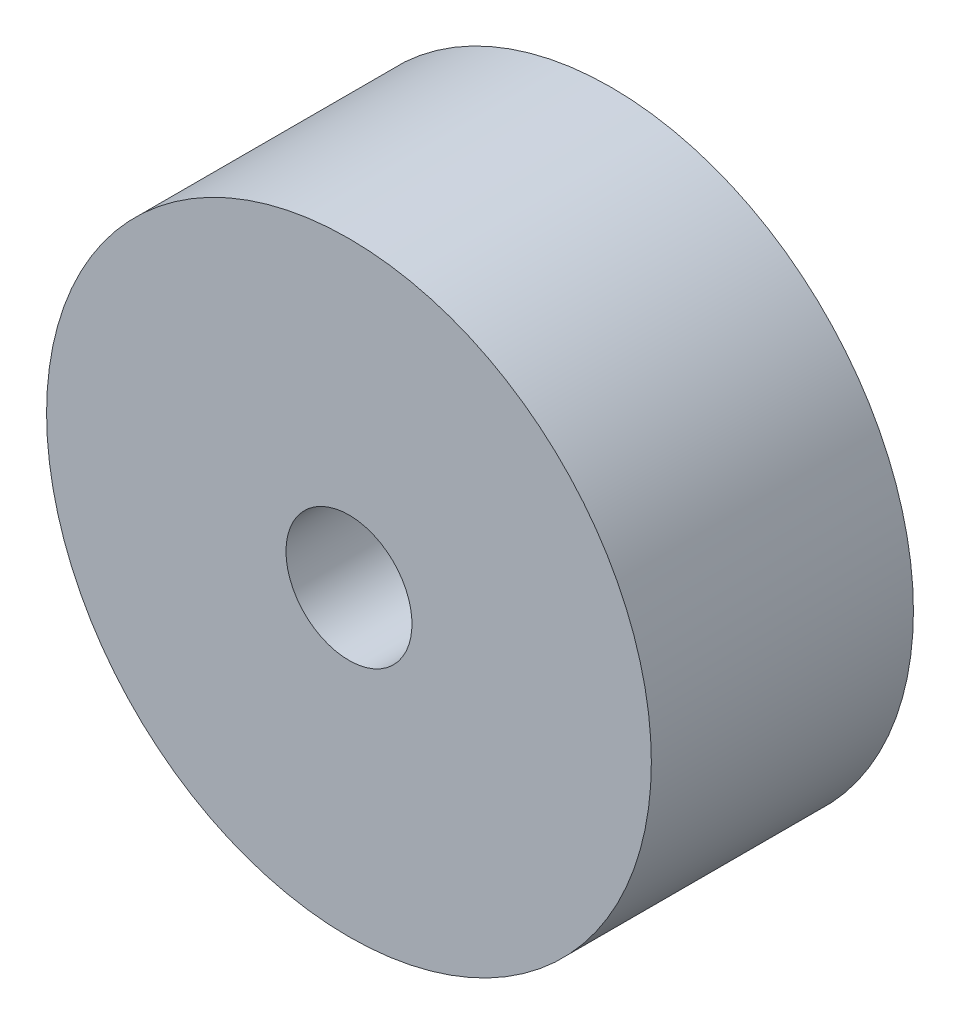
ISO-10303-21;
HEADER;
FILE_DESCRIPTION(('STEP AP214'),'2;1');
FILE_NAME('part.step','',(''),(''),'','','');
FILE_SCHEMA(('AUTOMOTIVE_DESIGN { 1 0 10303 214 1 1 1 1 }'));
ENDSEC;
DATA;
#1=APPLICATION_CONTEXT('core data for automotive mechanical design processes');
#2=APPLICATION_PROTOCOL_DEFINITION('international standard','automotive_design',2000,#1);
#3=PRODUCT_CONTEXT('',#1,'mechanical');
#4=PRODUCT('Part','Part','',(#3));
#5=PRODUCT_RELATED_PRODUCT_CATEGORY('part','',(#4));
#6=PRODUCT_DEFINITION_FORMATION('','',#4);
#7=PRODUCT_DEFINITION_CONTEXT('part definition',#1,'design');
#8=PRODUCT_DEFINITION('design','',#6,#7);
#9=PRODUCT_DEFINITION_SHAPE('','',#8);
#10=(LENGTH_UNIT() NAMED_UNIT(*) SI_UNIT(.MILLI.,.METRE.));
#11=(NAMED_UNIT(*) PLANE_ANGLE_UNIT() SI_UNIT($,.RADIAN.));
#12=(NAMED_UNIT(*) SI_UNIT($,.STERADIAN.) SOLID_ANGLE_UNIT());
#13=UNCERTAINTY_MEASURE_WITH_UNIT(LENGTH_MEASURE(1.E-05),#10,'distance_accuracy_value','');
#14=(GEOMETRIC_REPRESENTATION_CONTEXT(3) GLOBAL_UNCERTAINTY_ASSIGNED_CONTEXT((#13)) GLOBAL_UNIT_ASSIGNED_CONTEXT((#10,
#11,#12)) REPRESENTATION_CONTEXT('',''));
#15=CARTESIAN_POINT('',(0.,0.,0.));
#16=DIRECTION('',(0.,0.,1.));
#17=DIRECTION('',(1.,0.,0.));
#18=AXIS2_PLACEMENT_3D('',#15,#16,#17);
#19=CARTESIAN_POINT('',(0.,0.,26.));
#20=DIRECTION('',(0.,0.,1.));
#21=DIRECTION('',(1.,0.,0.));
#22=AXIS2_PLACEMENT_3D('',#19,#20,#21);
#23=PLANE('',#22);
#24=CARTESIAN_POINT('',(0.,0.,26.));
#25=DIRECTION('',(0.,0.,1.));
#26=DIRECTION('',(1.,0.,0.));
#27=AXIS2_PLACEMENT_3D('',#24,#25,#26);
#28=CIRCLE('',#27,30.);
#29=CARTESIAN_POINT('',(-30.,0.,26.));
#30=VERTEX_POINT('',#29);
#31=EDGE_CURVE('E10',#30,#30,#28,.T.);
#32=ORIENTED_EDGE('',*,*,#31,.T.);
#33=EDGE_LOOP('',(#32));
#34=FACE_BOUND('',#33,.T.);
#35=CARTESIAN_POINT('',(0.,0.,26.));
#36=DIRECTION('',(0.,0.,1.));
#37=DIRECTION('',(1.,0.,0.));
#38=AXIS2_PLACEMENT_3D('',#35,#36,#37);
#39=CIRCLE('',#38,6.25);
#40=CARTESIAN_POINT('',(-6.25,0.,26.));
#41=VERTEX_POINT('',#40);
#42=EDGE_CURVE('E42',#41,#41,#39,.T.);
#43=ORIENTED_EDGE('',*,*,#42,.F.);
#44=EDGE_LOOP('',(#43));
#45=FACE_BOUND('',#44,.T.);
#46=ADVANCED_FACE('F31',(#34,#45),#23,.T.);
#47=CARTESIAN_POINT('',(0.,0.,0.));
#48=DIRECTION('',(0.,0.,1.));
#49=DIRECTION('',(1.,0.,0.));
#50=AXIS2_PLACEMENT_3D('',#47,#48,#49);
#51=PLANE('',#50);
#52=CARTESIAN_POINT('',(0.,0.,0.));
#53=DIRECTION('',(0.,0.,1.));
#54=DIRECTION('',(1.,0.,0.));
#55=AXIS2_PLACEMENT_3D('',#52,#53,#54);
#56=CIRCLE('',#55,30.);
#57=CARTESIAN_POINT('',(-30.,0.,0.));
#58=VERTEX_POINT('',#57);
#59=EDGE_CURVE('E35',#58,#58,#56,.T.);
#60=ORIENTED_EDGE('',*,*,#59,.F.);
#61=EDGE_LOOP('',(#60));
#62=FACE_BOUND('',#61,.T.);
#63=CARTESIAN_POINT('',(0.,0.,0.));
#64=DIRECTION('',(0.,0.,1.));
#65=DIRECTION('',(1.,0.,0.));
#66=AXIS2_PLACEMENT_3D('',#63,#64,#65);
#67=CIRCLE('',#66,6.25);
#68=CARTESIAN_POINT('',(-6.25,0.,0.));
#69=VERTEX_POINT('',#68);
#70=EDGE_CURVE('E44',#69,#69,#67,.T.);
#71=ORIENTED_EDGE('',*,*,#70,.T.);
#72=EDGE_LOOP('',(#71));
#73=FACE_BOUND('',#72,.T.);
#74=ADVANCED_FACE('F54',(#62,#73),#51,.F.);
#75=CARTESIAN_POINT('',(0.,0.,26.));
#76=DIRECTION('',(0.,0.,-1.));
#77=DIRECTION('',(-1.,0.,0.));
#78=AXIS2_PLACEMENT_3D('',#75,#76,#77);
#79=CYLINDRICAL_SURFACE('',#78,30.);
#80=CARTESIAN_POINT('',(-30.,0.,26.));
#81=CARTESIAN_POINT('',(-30.,0.,25.7291666666667));
#82=CARTESIAN_POINT('',(-30.,0.,25.4583333333333));
#83=CARTESIAN_POINT('',(-30.,0.,24.9166666666667));
#84=CARTESIAN_POINT('',(-30.,0.,24.6458333333333));
#85=CARTESIAN_POINT('',(-30.,0.,24.1041666666667));
#86=CARTESIAN_POINT('',(-30.,0.,23.8333333333333));
#87=CARTESIAN_POINT('',(-30.,0.,23.2916666666667));
#88=CARTESIAN_POINT('',(-30.,0.,23.0208333333333));
#89=CARTESIAN_POINT('',(-30.,0.,22.4791666666667));
#90=CARTESIAN_POINT('',(-30.,0.,22.2083333333333));
#91=CARTESIAN_POINT('',(-30.,0.,21.6666666666667));
#92=CARTESIAN_POINT('',(-30.,0.,21.3958333333333));
#93=CARTESIAN_POINT('',(-30.,0.,20.8541666666667));
#94=CARTESIAN_POINT('',(-30.,0.,20.5833333333333));
#95=CARTESIAN_POINT('',(-30.,0.,20.0416666666667));
#96=CARTESIAN_POINT('',(-30.,0.,19.7708333333333));
#97=CARTESIAN_POINT('',(-30.,0.,19.2291666666667));
#98=CARTESIAN_POINT('',(-30.,0.,18.9583333333333));
#99=CARTESIAN_POINT('',(-30.,0.,18.4166666666667));
#100=CARTESIAN_POINT('',(-30.,0.,18.1458333333333));
#101=CARTESIAN_POINT('',(-30.,0.,17.6041666666667));
#102=CARTESIAN_POINT('',(-30.,0.,17.3333333333333));
#103=CARTESIAN_POINT('',(-30.,0.,16.7916666666667));
#104=CARTESIAN_POINT('',(-30.,0.,16.5208333333333));
#105=CARTESIAN_POINT('',(-30.,0.,15.9791666666667));
#106=CARTESIAN_POINT('',(-30.,0.,15.7083333333333));
#107=CARTESIAN_POINT('',(-30.,0.,15.1666666666667));
#108=CARTESIAN_POINT('',(-30.,0.,14.8958333333333));
#109=CARTESIAN_POINT('',(-30.,0.,14.3541666666667));
#110=CARTESIAN_POINT('',(-30.,0.,14.0833333333333));
#111=CARTESIAN_POINT('',(-30.,0.,13.5416666666667));
#112=CARTESIAN_POINT('',(-30.,0.,13.2708333333333));
#113=CARTESIAN_POINT('',(-30.,0.,12.7291666666667));
#114=CARTESIAN_POINT('',(-30.,0.,12.4583333333333));
#115=CARTESIAN_POINT('',(-30.,0.,11.9166666666667));
#116=CARTESIAN_POINT('',(-30.,0.,11.6458333333333));
#117=CARTESIAN_POINT('',(-30.,0.,11.1041666666667));
#118=CARTESIAN_POINT('',(-30.,0.,10.8333333333333));
#119=CARTESIAN_POINT('',(-30.,0.,10.2916666666667));
#120=CARTESIAN_POINT('',(-30.,0.,10.0208333333333));
#121=CARTESIAN_POINT('',(-30.,0.,9.47916666666667));
#122=CARTESIAN_POINT('',(-30.,0.,9.20833333333333));
#123=CARTESIAN_POINT('',(-30.,0.,8.66666666666667));
#124=CARTESIAN_POINT('',(-30.,0.,8.39583333333333));
#125=CARTESIAN_POINT('',(-30.,0.,7.85416666666667));
#126=CARTESIAN_POINT('',(-30.,0.,7.58333333333333));
#127=CARTESIAN_POINT('',(-30.,0.,7.04166666666667));
#128=CARTESIAN_POINT('',(-30.,0.,6.77083333333333));
#129=CARTESIAN_POINT('',(-30.,0.,6.22916666666667));
#130=CARTESIAN_POINT('',(-30.,0.,5.95833333333333));
#131=CARTESIAN_POINT('',(-30.,0.,5.41666666666667));
#132=CARTESIAN_POINT('',(-30.,0.,5.14583333333333));
#133=CARTESIAN_POINT('',(-30.,0.,4.60416666666667));
#134=CARTESIAN_POINT('',(-30.,0.,4.33333333333333));
#135=CARTESIAN_POINT('',(-30.,0.,3.79166666666667));
#136=CARTESIAN_POINT('',(-30.,0.,3.52083333333333));
#137=CARTESIAN_POINT('',(-30.,0.,2.97916666666667));
#138=CARTESIAN_POINT('',(-30.,0.,2.70833333333333));
#139=CARTESIAN_POINT('',(-30.,0.,2.16666666666667));
#140=CARTESIAN_POINT('',(-30.,0.,1.89583333333333));
#141=CARTESIAN_POINT('',(-30.,0.,1.35416666666667));
#142=CARTESIAN_POINT('',(-30.,0.,1.08333333333333));
#143=CARTESIAN_POINT('',(-30.,0.,0.541666666666667));
#144=CARTESIAN_POINT('',(-30.,0.,0.270833333333334));
#145=CARTESIAN_POINT('',(-30.,0.,0.));
#146=B_SPLINE_CURVE_WITH_KNOTS('',3,(#80,#81,#82,#83,#84,#85,#86,#87,#88,#89,#90,#91,#92,#93,
#94,#95,#96,#97,#98,#99,#100,#101,#102,#103,#104,#105,#106,#107,#108,#109,#110,#111,#112,#113,
#114,#115,#116,#117,#118,#119,#120,#121,#122,#123,#124,#125,#126,#127,#128,#129,#130,#131,#132,
#133,#134,#135,#136,#137,#138,#139,#140,#141,#142,#143,#144,#145),.UNSPECIFIED.,.F.,.F.,(4,2,2,
2,2,2,2,2,2,2,2,2,2,2,2,2,2,2,2,2,2,2,2,2,2,2,2,2,2,2,2,2,4),(0.,0.812500000000001,1.625,2.4375,
3.25,4.0625,4.875,5.6875,6.5,7.3125,8.125,8.9375,9.75,10.5625,11.375,12.1875,13.,13.8125,14.625,
15.4375,16.25,17.0625,17.875,18.6875,19.5,20.3125,21.125,21.9375,22.75,23.5625,24.375,25.1875,
26.),.UNSPECIFIED.);
#147=EDGE_CURVE('BSEAM33',#30,#58,#146,.T.);
#148=ORIENTED_EDGE('',*,*,#31,.F.);
#149=ORIENTED_EDGE('',*,*,#59,.T.);
#150=ORIENTED_EDGE('',*,*,#147,.T.);
#151=ORIENTED_EDGE('',*,*,#147,.F.);
#152=EDGE_LOOP('',(#148,#150,#149,#151));
#153=FACE_BOUND('',#152,.T.);
#154=ADVANCED_FACE('F33',(#153),#79,.T.);
#155=CARTESIAN_POINT('',(0.,0.,26.));
#156=DIRECTION('',(0.,0.,-1.));
#157=DIRECTION('',(-1.,0.,0.));
#158=AXIS2_PLACEMENT_3D('',#155,#156,#157);
#159=CYLINDRICAL_SURFACE('',#158,6.25);
#160=CARTESIAN_POINT('',(-6.25,0.,26.));
#161=CARTESIAN_POINT('',(-6.25,0.,25.7291666666667));
#162=CARTESIAN_POINT('',(-6.25,0.,25.4583333333333));
#163=CARTESIAN_POINT('',(-6.25,0.,24.9166666666667));
#164=CARTESIAN_POINT('',(-6.25,0.,24.6458333333333));
#165=CARTESIAN_POINT('',(-6.25,0.,24.1041666666667));
#166=CARTESIAN_POINT('',(-6.25,0.,23.8333333333333));
#167=CARTESIAN_POINT('',(-6.25,0.,23.2916666666667));
#168=CARTESIAN_POINT('',(-6.25,0.,23.0208333333333));
#169=CARTESIAN_POINT('',(-6.25,0.,22.4791666666667));
#170=CARTESIAN_POINT('',(-6.25,0.,22.2083333333333));
#171=CARTESIAN_POINT('',(-6.25,0.,21.6666666666667));
#172=CARTESIAN_POINT('',(-6.25,0.,21.3958333333333));
#173=CARTESIAN_POINT('',(-6.25,0.,20.8541666666667));
#174=CARTESIAN_POINT('',(-6.25,0.,20.5833333333333));
#175=CARTESIAN_POINT('',(-6.25,0.,20.0416666666667));
#176=CARTESIAN_POINT('',(-6.25,0.,19.7708333333333));
#177=CARTESIAN_POINT('',(-6.25,0.,19.2291666666667));
#178=CARTESIAN_POINT('',(-6.25,0.,18.9583333333333));
#179=CARTESIAN_POINT('',(-6.25,0.,18.4166666666667));
#180=CARTESIAN_POINT('',(-6.25,0.,18.1458333333333));
#181=CARTESIAN_POINT('',(-6.25,0.,17.6041666666667));
#182=CARTESIAN_POINT('',(-6.25,0.,17.3333333333333));
#183=CARTESIAN_POINT('',(-6.25,0.,16.7916666666667));
#184=CARTESIAN_POINT('',(-6.25,0.,16.5208333333333));
#185=CARTESIAN_POINT('',(-6.25,0.,15.9791666666667));
#186=CARTESIAN_POINT('',(-6.25,0.,15.7083333333333));
#187=CARTESIAN_POINT('',(-6.25,0.,15.1666666666667));
#188=CARTESIAN_POINT('',(-6.25,0.,14.8958333333333));
#189=CARTESIAN_POINT('',(-6.25,0.,14.3541666666667));
#190=CARTESIAN_POINT('',(-6.25,0.,14.0833333333333));
#191=CARTESIAN_POINT('',(-6.25,0.,13.5416666666667));
#192=CARTESIAN_POINT('',(-6.25,0.,13.2708333333333));
#193=CARTESIAN_POINT('',(-6.25,0.,12.7291666666667));
#194=CARTESIAN_POINT('',(-6.25,0.,12.4583333333333));
#195=CARTESIAN_POINT('',(-6.25,0.,11.9166666666667));
#196=CARTESIAN_POINT('',(-6.25,0.,11.6458333333333));
#197=CARTESIAN_POINT('',(-6.25,0.,11.1041666666667));
#198=CARTESIAN_POINT('',(-6.25,0.,10.8333333333333));
#199=CARTESIAN_POINT('',(-6.25,0.,10.2916666666667));
#200=CARTESIAN_POINT('',(-6.25,0.,10.0208333333333));
#201=CARTESIAN_POINT('',(-6.25,0.,9.47916666666667));
#202=CARTESIAN_POINT('',(-6.25,0.,9.20833333333333));
#203=CARTESIAN_POINT('',(-6.25,0.,8.66666666666667));
#204=CARTESIAN_POINT('',(-6.25,0.,8.39583333333333));
#205=CARTESIAN_POINT('',(-6.25,0.,7.85416666666667));
#206=CARTESIAN_POINT('',(-6.25,0.,7.58333333333333));
#207=CARTESIAN_POINT('',(-6.25,0.,7.04166666666667));
#208=CARTESIAN_POINT('',(-6.25,0.,6.77083333333333));
#209=CARTESIAN_POINT('',(-6.25,0.,6.22916666666667));
#210=CARTESIAN_POINT('',(-6.25,0.,5.95833333333333));
#211=CARTESIAN_POINT('',(-6.25,0.,5.41666666666667));
#212=CARTESIAN_POINT('',(-6.25,0.,5.14583333333333));
#213=CARTESIAN_POINT('',(-6.25,0.,4.60416666666667));
#214=CARTESIAN_POINT('',(-6.25,0.,4.33333333333333));
#215=CARTESIAN_POINT('',(-6.25,0.,3.79166666666667));
#216=CARTESIAN_POINT('',(-6.25,0.,3.52083333333333));
#217=CARTESIAN_POINT('',(-6.25,0.,2.97916666666667));
#218=CARTESIAN_POINT('',(-6.25,0.,2.70833333333333));
#219=CARTESIAN_POINT('',(-6.25,0.,2.16666666666667));
#220=CARTESIAN_POINT('',(-6.25,0.,1.89583333333333));
#221=CARTESIAN_POINT('',(-6.25,0.,1.35416666666667));
#222=CARTESIAN_POINT('',(-6.25,0.,1.08333333333333));
#223=CARTESIAN_POINT('',(-6.25,0.,0.541666666666667));
#224=CARTESIAN_POINT('',(-6.25,0.,0.270833333333334));
#225=CARTESIAN_POINT('',(-6.25,0.,0.));
#226=B_SPLINE_CURVE_WITH_KNOTS('',3,(#160,#161,#162,#163,#164,#165,#166,#167,#168,#169,#170,
#171,#172,#173,#174,#175,#176,#177,#178,#179,#180,#181,#182,#183,#184,#185,#186,#187,#188,#189,
#190,#191,#192,#193,#194,#195,#196,#197,#198,#199,#200,#201,#202,#203,#204,#205,#206,#207,#208,
#209,#210,#211,#212,#213,#214,#215,#216,#217,#218,#219,#220,#221,#222,#223,#224,#225),
.UNSPECIFIED.,.F.,.F.,(4,2,2,2,2,2,2,2,2,2,2,2,2,2,2,2,2,2,2,2,2,2,2,2,2,2,2,2,2,2,2,2,4),(0.,
0.812500000000001,1.625,2.4375,3.25,4.0625,4.875,5.6875,6.5,7.3125,8.125,8.9375,9.75,10.5625,
11.375,12.1875,13.,13.8125,14.625,15.4375,16.25,17.0625,17.875,18.6875,19.5,20.3125,21.125,
21.9375,22.75,23.5625,24.375,25.1875,26.),.UNSPECIFIED.);
#227=EDGE_CURVE('BSEAM50',#41,#69,#226,.T.);
#228=ORIENTED_EDGE('',*,*,#42,.T.);
#229=ORIENTED_EDGE('',*,*,#70,.F.);
#230=ORIENTED_EDGE('',*,*,#227,.T.);
#231=ORIENTED_EDGE('',*,*,#227,.F.);
#232=EDGE_LOOP('',(#228,#230,#229,#231));
#233=FACE_BOUND('',#232,.T.);
#234=ADVANCED_FACE('F50',(#233),#159,.F.);
#235=CLOSED_SHELL('',(#46,#74,#154,#234));
#236=MANIFOLD_SOLID_BREP('B2',#235);
#237=ADVANCED_BREP_SHAPE_REPRESENTATION('',(#18,#236),#14);
#238=SHAPE_DEFINITION_REPRESENTATION(#9,#237);
ENDSEC;
END-ISO-10303-21;
